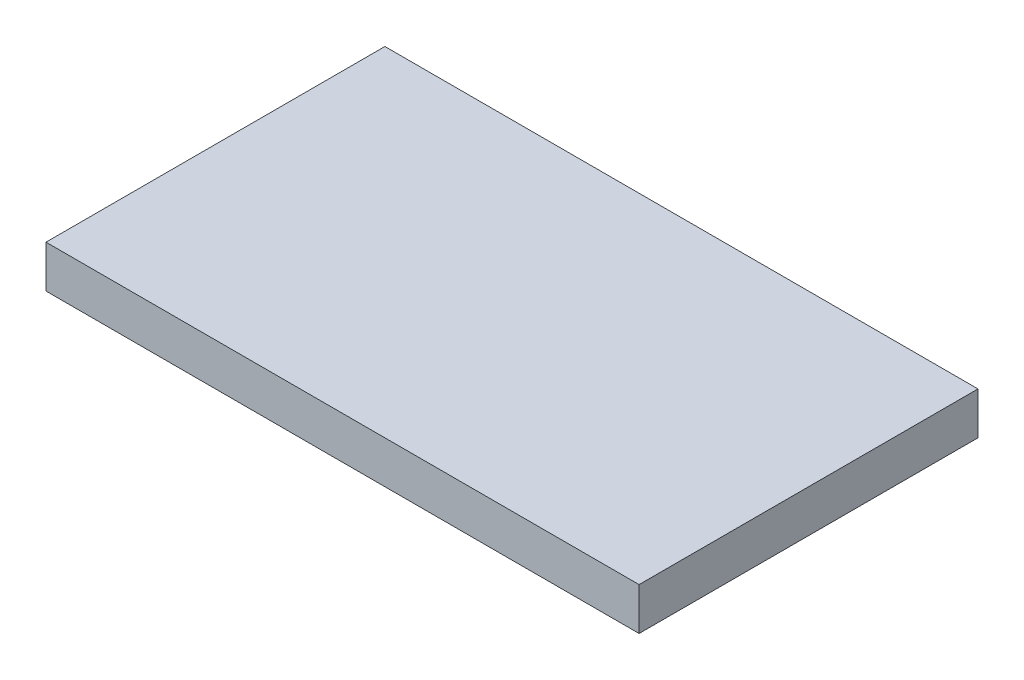
ISO-10303-21;
HEADER;
FILE_DESCRIPTION(('STEP AP214'),'2;1');
FILE_NAME('part.step','',(''),(''),'','','');
FILE_SCHEMA(('AUTOMOTIVE_DESIGN { 1 0 10303 214 1 1 1 1 }'));
ENDSEC;
DATA;
#1=APPLICATION_CONTEXT('core data for automotive mechanical design processes');
#2=APPLICATION_PROTOCOL_DEFINITION('international standard','automotive_design',2000,#1);
#3=PRODUCT_CONTEXT('',#1,'mechanical');
#4=PRODUCT('Part','Part','',(#3));
#5=PRODUCT_RELATED_PRODUCT_CATEGORY('part','',(#4));
#6=PRODUCT_DEFINITION_FORMATION('','',#4);
#7=PRODUCT_DEFINITION_CONTEXT('part definition',#1,'design');
#8=PRODUCT_DEFINITION('design','',#6,#7);
#9=PRODUCT_DEFINITION_SHAPE('','',#8);
#10=(LENGTH_UNIT() NAMED_UNIT(*) SI_UNIT(.MILLI.,.METRE.));
#11=(NAMED_UNIT(*) PLANE_ANGLE_UNIT() SI_UNIT($,.RADIAN.));
#12=(NAMED_UNIT(*) SI_UNIT($,.STERADIAN.) SOLID_ANGLE_UNIT());
#13=UNCERTAINTY_MEASURE_WITH_UNIT(LENGTH_MEASURE(1.E-05),#10,'distance_accuracy_value','');
#14=(GEOMETRIC_REPRESENTATION_CONTEXT(3) GLOBAL_UNCERTAINTY_ASSIGNED_CONTEXT((#13)) GLOBAL_UNIT_ASSIGNED_CONTEXT((#10,
#11,#12)) REPRESENTATION_CONTEXT('',''));
#15=CARTESIAN_POINT('',(0.,0.,0.));
#16=DIRECTION('',(0.,0.,1.));
#17=DIRECTION('',(1.,0.,0.));
#18=AXIS2_PLACEMENT_3D('',#15,#16,#17);
#19=CARTESIAN_POINT('',(-70.,20.,510.));
#20=DIRECTION('',(0.,0.,1.));
#21=DIRECTION('',(1.,0.,0.));
#22=AXIS2_PLACEMENT_3D('',#19,#20,#21);
#23=PLANE('',#22);
#24=DIRECTION('',(0.,1.,0.));
#25=VECTOR('',#24,1.);
#26=CARTESIAN_POINT('',(-70.,20.,510.));
#27=LINE('',#26,#25);
#28=CARTESIAN_POINT('',(-70.,20.,510.));
#29=VERTEX_POINT('',#28);
#30=CARTESIAN_POINT('',(-70.,30.,510.));
#31=VERTEX_POINT('',#30);
#32=EDGE_CURVE('E85',#29,#31,#27,.T.);
#33=ORIENTED_EDGE('',*,*,#32,.F.);
#34=DIRECTION('',(1.,0.,0.));
#35=VECTOR('',#34,1.);
#36=CARTESIAN_POINT('',(-70.,20.,510.));
#37=LINE('',#36,#35);
#38=CARTESIAN_POINT('',(70.,20.,510.));
#39=VERTEX_POINT('',#38);
#40=EDGE_CURVE('E63',#29,#39,#37,.T.);
#41=ORIENTED_EDGE('',*,*,#40,.T.);
#42=DIRECTION('',(0.,1.,0.));
#43=VECTOR('',#42,1.);
#44=CARTESIAN_POINT('',(70.,20.,510.));
#45=LINE('',#44,#43);
#46=CARTESIAN_POINT('',(70.,30.,510.));
#47=VERTEX_POINT('',#46);
#48=EDGE_CURVE('E76',#39,#47,#45,.T.);
#49=ORIENTED_EDGE('',*,*,#48,.T.);
#50=DIRECTION('',(1.,0.,0.));
#51=VECTOR('',#50,1.);
#52=CARTESIAN_POINT('',(-70.,30.,510.));
#53=LINE('',#52,#51);
#54=EDGE_CURVE('E9',#31,#47,#53,.T.);
#55=ORIENTED_EDGE('',*,*,#54,.F.);
#56=EDGE_LOOP('',(#33,#41,#49,#55));
#57=FACE_BOUND('',#56,.T.);
#58=ADVANCED_FACE('F15',(#57),#23,.T.);
#59=CARTESIAN_POINT('',(-70.,20.,430.));
#60=DIRECTION('',(0.,0.,1.));
#61=DIRECTION('',(1.,0.,0.));
#62=AXIS2_PLACEMENT_3D('',#59,#60,#61);
#63=PLANE('',#62);
#64=DIRECTION('',(1.,0.,0.));
#65=VECTOR('',#64,1.);
#66=CARTESIAN_POINT('',(-70.,30.,430.));
#67=LINE('',#66,#65);
#68=CARTESIAN_POINT('',(-70.,30.,430.));
#69=VERTEX_POINT('',#68);
#70=CARTESIAN_POINT('',(70.,30.,430.));
#71=VERTEX_POINT('',#70);
#72=EDGE_CURVE('E25',#69,#71,#67,.T.);
#73=ORIENTED_EDGE('',*,*,#72,.T.);
#74=DIRECTION('',(0.,1.,0.));
#75=VECTOR('',#74,1.);
#76=CARTESIAN_POINT('',(70.,20.,430.));
#77=LINE('',#76,#75);
#78=CARTESIAN_POINT('',(70.,20.,430.));
#79=VERTEX_POINT('',#78);
#80=EDGE_CURVE('E99',#79,#71,#77,.T.);
#81=ORIENTED_EDGE('',*,*,#80,.F.);
#82=DIRECTION('',(1.,0.,0.));
#83=VECTOR('',#82,1.);
#84=CARTESIAN_POINT('',(-70.,20.,430.));
#85=LINE('',#84,#83);
#86=CARTESIAN_POINT('',(-70.,20.,430.));
#87=VERTEX_POINT('',#86);
#88=EDGE_CURVE('E74',#87,#79,#85,.T.);
#89=ORIENTED_EDGE('',*,*,#88,.F.);
#90=DIRECTION('',(0.,1.,0.));
#91=VECTOR('',#90,1.);
#92=CARTESIAN_POINT('',(-70.,20.,430.));
#93=LINE('',#92,#91);
#94=EDGE_CURVE('E82',#87,#69,#93,.T.);
#95=ORIENTED_EDGE('',*,*,#94,.T.);
#96=EDGE_LOOP('',(#73,#81,#89,#95));
#97=FACE_BOUND('',#96,.T.);
#98=ADVANCED_FACE('F17',(#97),#63,.F.);
#99=CARTESIAN_POINT('',(-70.,30.,430.));
#100=DIRECTION('',(0.,1.,0.));
#101=DIRECTION('',(1.,0.,0.));
#102=AXIS2_PLACEMENT_3D('',#99,#100,#101);
#103=PLANE('',#102);
#104=ORIENTED_EDGE('',*,*,#72,.F.);
#105=DIRECTION('',(0.,0.,1.));
#106=VECTOR('',#105,1.);
#107=CARTESIAN_POINT('',(-70.,30.,430.));
#108=LINE('',#107,#106);
#109=EDGE_CURVE('E86',#69,#31,#108,.T.);
#110=ORIENTED_EDGE('',*,*,#109,.T.);
#111=ORIENTED_EDGE('',*,*,#54,.T.);
#112=DIRECTION('',(0.,0.,1.));
#113=VECTOR('',#112,1.);
#114=CARTESIAN_POINT('',(70.,30.,430.));
#115=LINE('',#114,#113);
#116=EDGE_CURVE('E96',#71,#47,#115,.T.);
#117=ORIENTED_EDGE('',*,*,#116,.F.);
#118=EDGE_LOOP('',(#104,#110,#111,#117));
#119=FACE_BOUND('',#118,.T.);
#120=ADVANCED_FACE('F113',(#119),#103,.T.);
#121=CARTESIAN_POINT('',(-70.,20.,430.));
#122=DIRECTION('',(0.,1.,0.));
#123=DIRECTION('',(1.,0.,0.));
#124=AXIS2_PLACEMENT_3D('',#121,#122,#123);
#125=PLANE('',#124);
#126=DIRECTION('',(0.,0.,1.));
#127=VECTOR('',#126,1.);
#128=CARTESIAN_POINT('',(70.,20.,430.));
#129=LINE('',#128,#127);
#130=EDGE_CURVE('E69',#79,#39,#129,.T.);
#131=ORIENTED_EDGE('',*,*,#130,.T.);
#132=ORIENTED_EDGE('',*,*,#40,.F.);
#133=DIRECTION('',(0.,0.,1.));
#134=VECTOR('',#133,1.);
#135=CARTESIAN_POINT('',(-70.,20.,430.));
#136=LINE('',#135,#134);
#137=EDGE_CURVE('E70',#87,#29,#136,.T.);
#138=ORIENTED_EDGE('',*,*,#137,.F.);
#139=ORIENTED_EDGE('',*,*,#88,.T.);
#140=EDGE_LOOP('',(#131,#132,#138,#139));
#141=FACE_BOUND('',#140,.T.);
#142=ADVANCED_FACE('F66',(#141),#125,.F.);
#143=CARTESIAN_POINT('',(70.,20.,430.));
#144=DIRECTION('',(1.,0.,0.));
#145=DIRECTION('',(0.,1.,0.));
#146=AXIS2_PLACEMENT_3D('',#143,#144,#145);
#147=PLANE('',#146);
#148=ORIENTED_EDGE('',*,*,#130,.F.);
#149=ORIENTED_EDGE('',*,*,#80,.T.);
#150=ORIENTED_EDGE('',*,*,#116,.T.);
#151=ORIENTED_EDGE('',*,*,#48,.F.);
#152=EDGE_LOOP('',(#148,#149,#150,#151));
#153=FACE_BOUND('',#152,.T.);
#154=ADVANCED_FACE('F111',(#153),#147,.T.);
#155=CARTESIAN_POINT('',(-70.,20.,430.));
#156=DIRECTION('',(1.,0.,0.));
#157=DIRECTION('',(0.,1.,0.));
#158=AXIS2_PLACEMENT_3D('',#155,#156,#157);
#159=PLANE('',#158);
#160=ORIENTED_EDGE('',*,*,#32,.T.);
#161=ORIENTED_EDGE('',*,*,#109,.F.);
#162=ORIENTED_EDGE('',*,*,#94,.F.);
#163=ORIENTED_EDGE('',*,*,#137,.T.);
#164=EDGE_LOOP('',(#160,#161,#162,#163));
#165=FACE_BOUND('',#164,.T.);
#166=ADVANCED_FACE('F79',(#165),#159,.F.);
#167=CLOSED_SHELL('',(#58,#98,#120,#142,#154,#166));
#168=MANIFOLD_SOLID_BREP('B1',#167);
#169=ADVANCED_BREP_SHAPE_REPRESENTATION('',(#18,#168),#14);
#170=SHAPE_DEFINITION_REPRESENTATION(#9,#169);
ENDSEC;
END-ISO-10303-21;
